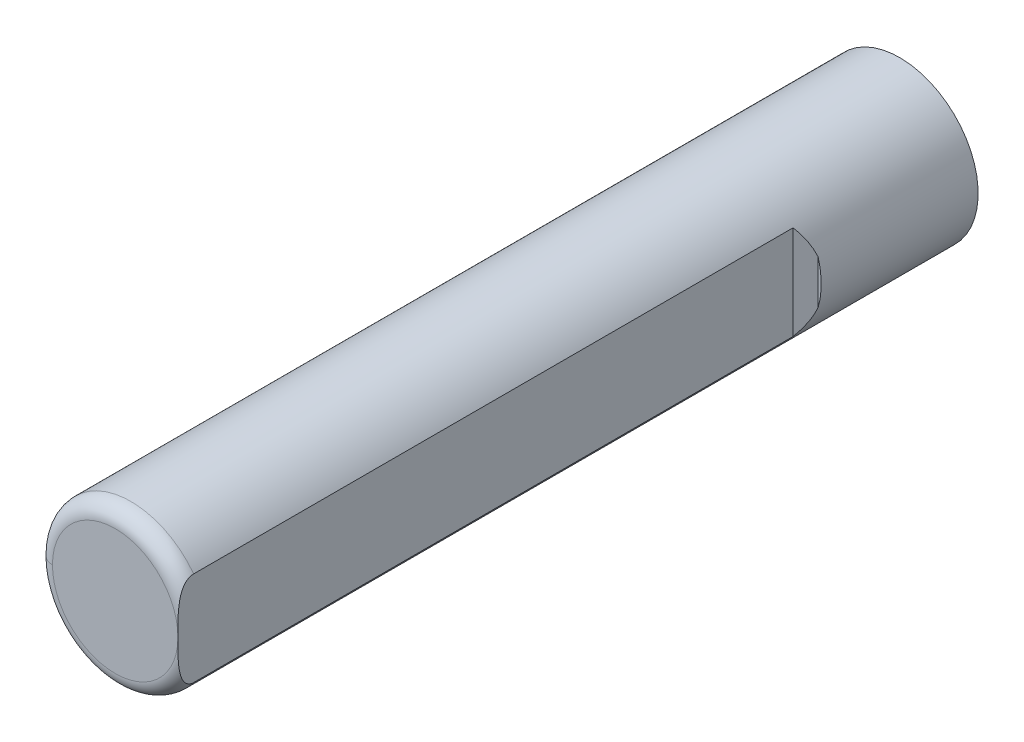
ISO-10303-21;
HEADER;
FILE_DESCRIPTION(('STEP AP214'),'2;1');
FILE_NAME('part.step','',(''),(''),'','','');
FILE_SCHEMA(('AUTOMOTIVE_DESIGN { 1 0 10303 214 1 1 1 1 }'));
ENDSEC;
DATA;
#1=APPLICATION_CONTEXT('core data for automotive mechanical design processes');
#2=APPLICATION_PROTOCOL_DEFINITION('international standard','automotive_design',2000,#1);
#3=PRODUCT_CONTEXT('',#1,'mechanical');
#4=PRODUCT('Part','Part','',(#3));
#5=PRODUCT_RELATED_PRODUCT_CATEGORY('part','',(#4));
#6=PRODUCT_DEFINITION_FORMATION('','',#4);
#7=PRODUCT_DEFINITION_CONTEXT('part definition',#1,'design');
#8=PRODUCT_DEFINITION('design','',#6,#7);
#9=PRODUCT_DEFINITION_SHAPE('','',#8);
#10=(LENGTH_UNIT() NAMED_UNIT(*) SI_UNIT(.MILLI.,.METRE.));
#11=(NAMED_UNIT(*) PLANE_ANGLE_UNIT() SI_UNIT($,.RADIAN.));
#12=(NAMED_UNIT(*) SI_UNIT($,.STERADIAN.) SOLID_ANGLE_UNIT());
#13=UNCERTAINTY_MEASURE_WITH_UNIT(LENGTH_MEASURE(1.E-05),#10,'distance_accuracy_value','');
#14=(GEOMETRIC_REPRESENTATION_CONTEXT(3) GLOBAL_UNCERTAINTY_ASSIGNED_CONTEXT((#13)) GLOBAL_UNIT_ASSIGNED_CONTEXT((#10,
#11,#12)) REPRESENTATION_CONTEXT('',''));
#15=CARTESIAN_POINT('',(0.,0.,0.));
#16=DIRECTION('',(0.,0.,1.));
#17=DIRECTION('',(1.,0.,0.));
#18=AXIS2_PLACEMENT_3D('',#15,#16,#17);
#19=CARTESIAN_POINT('',(0.,0.,0.));
#20=DIRECTION('',(0.,0.,1.));
#21=DIRECTION('',(1.,0.,0.));
#22=AXIS2_PLACEMENT_3D('',#19,#20,#21);
#23=PLANE('',#22);
#24=CARTESIAN_POINT('',(0.,0.,0.));
#25=DIRECTION('',(0.,0.,1.));
#26=DIRECTION('',(1.,0.,0.));
#27=AXIS2_PLACEMENT_3D('',#24,#25,#26);
#28=CIRCLE('',#27,2.5);
#29=CARTESIAN_POINT('',(-2.5,0.,0.));
#30=VERTEX_POINT('',#29);
#31=EDGE_CURVE('E11',#30,#30,#28,.T.);
#32=ORIENTED_EDGE('',*,*,#31,.F.);
#33=EDGE_LOOP('',(#32));
#34=FACE_BOUND('',#33,.T.);
#35=ADVANCED_FACE('F17',(#34),#23,.F.);
#36=CARTESIAN_POINT('',(0.,0.,25.));
#37=DIRECTION('',(0.,0.,1.));
#38=DIRECTION('',(1.,0.,0.));
#39=AXIS2_PLACEMENT_3D('',#36,#37,#38);
#40=PLANE('',#39);
#41=CARTESIAN_POINT('',(0.,0.,25.));
#42=DIRECTION('',(0.,0.,-1.));
#43=DIRECTION('',(-1.,0.,0.));
#44=AXIS2_PLACEMENT_3D('',#41,#42,#43);
#45=CIRCLE('',#44,2.);
#46=CARTESIAN_POINT('',(2.,0.,25.));
#47=VERTEX_POINT('',#46);
#48=CARTESIAN_POINT('',(-2.,0.,25.));
#49=VERTEX_POINT('',#48);
#50=EDGE_CURVE('E94',#47,#49,#45,.T.);
#51=ORIENTED_EDGE('',*,*,#50,.F.);
#52=CARTESIAN_POINT('',(0.,0.,25.));
#53=DIRECTION('',(0.,0.,-1.));
#54=DIRECTION('',(-1.,0.,0.));
#55=AXIS2_PLACEMENT_3D('',#52,#53,#54);
#56=CIRCLE('',#55,2.);
#57=EDGE_CURVE('E119',#49,#47,#56,.T.);
#58=ORIENTED_EDGE('',*,*,#57,.F.);
#59=EDGE_LOOP('',(#51,#58));
#60=FACE_BOUND('',#59,.T.);
#61=ADVANCED_FACE('F143',(#60),#40,.T.);
#62=CARTESIAN_POINT('',(0.,0.,0.));
#63=DIRECTION('',(0.,0.,1.));
#64=DIRECTION('',(1.,0.,0.));
#65=AXIS2_PLACEMENT_3D('',#62,#63,#64);
#66=CYLINDRICAL_SURFACE('',#65,2.5);
#67=CARTESIAN_POINT('',(0.,0.,24.5));
#68=DIRECTION('',(0.,0.,1.));
#69=DIRECTION('',(-1.,0.,0.));
#70=AXIS2_PLACEMENT_3D('',#67,#68,#69);
#71=CIRCLE('',#70,2.5);
#72=CARTESIAN_POINT('',(2.,1.5,24.5));
#73=VERTEX_POINT('',#72);
#74=CARTESIAN_POINT('',(-2.5,0.,24.5));
#75=VERTEX_POINT('',#74);
#76=EDGE_CURVE('E90',#73,#75,#71,.T.);
#77=ORIENTED_EDGE('',*,*,#76,.F.);
#78=DIRECTION('',(0.,0.,-1.));
#79=VECTOR('',#78,1.);
#80=CARTESIAN_POINT('',(2.,1.5,0.));
#81=LINE('',#80,#79);
#82=CARTESIAN_POINT('',(2.,1.5,5.4));
#83=VERTEX_POINT('',#82);
#84=EDGE_CURVE('E84',#73,#83,#81,.T.);
#85=ORIENTED_EDGE('',*,*,#84,.T.);
#86=CARTESIAN_POINT('',(0.,0.,7.4));
#87=DIRECTION('',(0.707106781186548,0.,0.707106781186547));
#88=DIRECTION('',(0.707106781186547,0.,-0.707106781186548));
#89=AXIS2_PLACEMENT_3D('',#86,#87,#88);
#90=ELLIPSE('',#89,3.53553390593274,2.5);
#91=CARTESIAN_POINT('',(2.4,0.7,5.));
#92=VERTEX_POINT('',#91);
#93=EDGE_CURVE('E87',#92,#83,#90,.T.);
#94=ORIENTED_EDGE('',*,*,#93,.F.);
#95=CARTESIAN_POINT('',(0.,0.,5.));
#96=DIRECTION('',(0.,0.,-1.));
#97=DIRECTION('',(1.,0.,0.));
#98=AXIS2_PLACEMENT_3D('',#95,#96,#97);
#99=CIRCLE('',#98,2.5);
#100=CARTESIAN_POINT('',(2.4,-0.7,5.));
#101=VERTEX_POINT('',#100);
#102=EDGE_CURVE('E55',#92,#101,#99,.T.);
#103=ORIENTED_EDGE('',*,*,#102,.T.);
#104=CARTESIAN_POINT('',(0.,0.,7.4));
#105=DIRECTION('',(0.707106781186548,0.,0.707106781186547));
#106=DIRECTION('',(0.707106781186547,0.,-0.707106781186548));
#107=AXIS2_PLACEMENT_3D('',#104,#105,#106);
#108=ELLIPSE('',#107,3.53553390593274,2.5);
#109=CARTESIAN_POINT('',(2.,-1.5,5.4));
#110=VERTEX_POINT('',#109);
#111=EDGE_CURVE('E110',#110,#101,#108,.T.);
#112=ORIENTED_EDGE('',*,*,#111,.F.);
#113=DIRECTION('',(0.,0.,1.));
#114=VECTOR('',#113,1.);
#115=CARTESIAN_POINT('',(2.,-1.5,0.));
#116=LINE('',#115,#114);
#117=CARTESIAN_POINT('',(2.,-1.5,24.5));
#118=VERTEX_POINT('',#117);
#119=EDGE_CURVE('E69',#110,#118,#116,.T.);
#120=ORIENTED_EDGE('',*,*,#119,.T.);
#121=CARTESIAN_POINT('',(0.,0.,24.5));
#122=DIRECTION('',(0.,0.,1.));
#123=DIRECTION('',(-1.,0.,0.));
#124=AXIS2_PLACEMENT_3D('',#121,#122,#123);
#125=CIRCLE('',#124,2.5);
#126=EDGE_CURVE('E253',#75,#118,#125,.T.);
#127=ORIENTED_EDGE('',*,*,#126,.F.);
#128=DIRECTION('',(0.,0.,-1.));
#129=VECTOR('',#128,1.);
#130=CARTESIAN_POINT('',(-2.5,0.,0.));
#131=LINE('',#130,#129);
#132=EDGE_CURVE('E29',#75,#30,#131,.T.);
#133=ORIENTED_EDGE('',*,*,#132,.T.);
#134=ORIENTED_EDGE('',*,*,#31,.T.);
#135=ORIENTED_EDGE('',*,*,#132,.F.);
#136=EDGE_LOOP('',(#77,#85,#94,#103,#112,#120,#127,#133,#134,#135));
#137=FACE_BOUND('',#136,.T.);
#138=ADVANCED_FACE('F85',(#137),#66,.T.);
#139=CARTESIAN_POINT('',(2.,-1.5,25.));
#140=DIRECTION('',(-1.,0.,0.));
#141=DIRECTION('',(0.,0.,1.));
#142=AXIS2_PLACEMENT_3D('',#139,#140,#141);
#143=PLANE('',#142);
#144=DIRECTION('',(0.,-1.,0.));
#145=VECTOR('',#144,1.);
#146=CARTESIAN_POINT('',(2.,-0.75,5.4));
#147=LINE('',#146,#145);
#148=EDGE_CURVE('E96',#83,#110,#147,.T.);
#149=ORIENTED_EDGE('',*,*,#148,.F.);
#150=ORIENTED_EDGE('',*,*,#84,.F.);
#151=CARTESIAN_POINT('',(2.,0.,25.));
#152=CARTESIAN_POINT('',(1.99992074184323,0.0743824040081505,24.9997759435756));
#153=CARTESIAN_POINT('',(1.99947165010355,0.148776999914972,24.9999871771074));
#154=CARTESIAN_POINT('',(1.99857028946612,0.295155966065459,24.9997552066879));
#155=CARTESIAN_POINT('',(1.99811859337683,0.367140448301951,24.9993329535788));
#156=CARTESIAN_POINT('',(1.99791959116584,0.47467564178265,24.9972067174446));
#157=CARTESIAN_POINT('',(1.99793155447054,0.510237151865557,24.99625912338));
#158=CARTESIAN_POINT('',(1.99809267915469,0.581288801031755,24.9935472748416));
#159=CARTESIAN_POINT('',(1.99824167988418,0.616778974929288,24.9917839778249));
#160=CARTESIAN_POINT('',(1.99862313534803,0.687809287827659,24.9871059654056));
#161=CARTESIAN_POINT('',(1.99885587167854,0.723349187429095,24.9841873614385));
#162=CARTESIAN_POINT('',(1.99916605741556,0.776633119726084,24.9786642473142));
#163=CARTESIAN_POINT('',(1.99926316559772,0.79443591334173,24.9766256027941));
#164=CARTESIAN_POINT('',(1.99942799313971,0.830070067970469,24.9721067798214));
#165=CARTESIAN_POINT('',(1.99949557357409,0.847901176122075,24.9696245899772));
#166=CARTESIAN_POINT('',(1.99955300446813,0.888547536486016,24.9634177503319));
#167=CARTESIAN_POINT('',(1.99951532397822,0.91133988401974,24.9595404524321));
#168=CARTESIAN_POINT('',(1.99930867283003,0.955943231038525,24.9510482605722));
#169=CARTESIAN_POINT('',(1.99914444800875,0.977760164027869,24.9464647218206));
#170=CARTESIAN_POINT('',(1.9987470058683,1.02036229047338,24.9365155069451));
#171=CARTESIAN_POINT('',(1.99851657793048,1.04115570548247,24.9311852083642));
#172=CARTESIAN_POINT('',(1.99802974814901,1.0816574895716,24.9197062246499));
#173=CARTESIAN_POINT('',(1.99777468449466,1.10137685141119,24.913596853842));
#174=CARTESIAN_POINT('',(1.99739840013948,1.13038024379066,24.9036976133648));
#175=CARTESIAN_POINT('',(1.99727587510661,1.13981027725539,24.900332804047));
#176=CARTESIAN_POINT('',(1.99703817581608,1.15837649346644,24.8933928369149));
#177=CARTESIAN_POINT('',(1.99692290310413,1.16751476547877,24.8898232958931));
#178=CARTESIAN_POINT('',(1.99670332283443,1.18548877285787,24.8824714382482));
#179=CARTESIAN_POINT('',(1.99659883979227,1.19432687958857,24.8786949344353));
#180=CARTESIAN_POINT('',(1.99640396912614,1.21169177323568,24.8709270027819));
#181=CARTESIAN_POINT('',(1.99631333664323,1.22022122896917,24.8669415608728));
#182=CARTESIAN_POINT('',(1.99614882223497,1.2369596175537,24.8587541929477));
#183=CARTESIAN_POINT('',(1.99607463467166,1.24517153585325,24.8545583896463));
#184=CARTESIAN_POINT('',(1.99594517300726,1.26126533183318,24.8459493011108));
#185=CARTESIAN_POINT('',(1.99588954260673,1.26915052438995,24.8415422314282));
#186=CARTESIAN_POINT('',(1.9957988546951,1.2845810374423,24.8325102373854));
#187=CARTESIAN_POINT('',(1.99576340175056,1.2921300087043,24.8278915673767));
#188=CARTESIAN_POINT('',(1.99571421125412,1.3068779700524,24.8184366653795));
#189=CARTESIAN_POINT('',(1.99570005204294,1.31408094375696,24.8136066625062));
#190=CARTESIAN_POINT('',(1.99569406125293,1.32812655721362,24.803730101339));
#191=CARTESIAN_POINT('',(1.99570179589208,1.3349734981079,24.7986896728774));
#192=CARTESIAN_POINT('',(1.99573966154816,1.34829649729819,24.7883940205325));
#193=CARTESIAN_POINT('',(1.99576936162992,1.35477714326881,24.783144744193));
#194=CARTESIAN_POINT('',(1.99585066984195,1.36735684576008,24.772433972697));
#195=CARTESIAN_POINT('',(1.99590186522548,1.373460726845,24.7669781522206));
#196=CARTESIAN_POINT('',(1.99602510856625,1.38527614180958,24.7558576563887));
#197=CARTESIAN_POINT('',(1.99609677691371,1.39099266463528,24.7501982893881));
#198=CARTESIAN_POINT('',(1.99625932484143,1.4020224438202,24.7386751435514));
#199=CARTESIAN_POINT('',(1.99634987174126,1.4073407595873,24.732816209216));
#200=CARTESIAN_POINT('',(1.99654796864135,1.41756375853488,24.7208985534172));
#201=CARTESIAN_POINT('',(1.99665524381451,1.42247344194377,24.7148441357418));
#202=CARTESIAN_POINT('',(1.99682731556004,1.42954211500895,24.7055881483673));
#203=CARTESIAN_POINT('',(1.99688620021312,1.4318379198452,24.7024902036541));
#204=CARTESIAN_POINT('',(1.99700706247235,1.43632276646332,24.6962473266312));
#205=CARTESIAN_POINT('',(1.99706901833451,1.43851238813219,24.6931028115351));
#206=CARTESIAN_POINT('',(1.99719558211312,1.44278346410645,24.686767770409));
#207=CARTESIAN_POINT('',(1.99726017252742,1.44486547300804,24.6835776179058));
#208=CARTESIAN_POINT('',(1.9973915254633,1.44892005216089,24.677152204731));
#209=CARTESIAN_POINT('',(1.99745827461723,1.45089314521046,24.6739172738808));
#210=CARTESIAN_POINT('',(1.99759342793202,1.45472860421019,24.6674032994356));
#211=CARTESIAN_POINT('',(1.99766182263048,1.45659145540954,24.6641245414755));
#212=CARTESIAN_POINT('',(1.99779971224839,1.46020516767773,24.6575239569899));
#213=CARTESIAN_POINT('',(1.99786920126793,1.46195647040382,24.6542023722468));
#214=CARTESIAN_POINT('',(1.99800868722428,1.46534583949,24.6475172389961));
#215=CARTESIAN_POINT('',(1.99807868136002,1.46698429794566,24.6441538893039));
#216=CARTESIAN_POINT('',(1.99821854776643,1.47014675399115,24.6373863885316));
#217=CARTESIAN_POINT('',(1.99828841974943,1.47167108825015,24.6339823948332));
#218=CARTESIAN_POINT('',(1.99842737472124,1.47460409441989,24.627134826837));
#219=CARTESIAN_POINT('',(1.99849645922938,1.4760130419326,24.623691370662));
#220=CARTESIAN_POINT('',(1.99863313494216,1.47871409833955,24.6167661566476));
#221=CARTESIAN_POINT('',(1.99870072864957,1.48000641645379,24.6132844804883));
#222=CARTESIAN_POINT('',(1.99883368148878,1.48247306489063,24.6062841635624));
#223=CARTESIAN_POINT('',(1.99889904317281,1.48364753316845,24.6027655714698));
#224=CARTESIAN_POINT('',(1.99902675399531,1.48587736176063,24.5956928177327));
#225=CARTESIAN_POINT('',(1.99908910470066,1.4869327844153,24.5921386757761));
#226=CARTESIAN_POINT('',(1.99920997921112,1.48892343241179,24.5849962752541));
#227=CARTESIAN_POINT('',(1.99926850247444,1.4898586407548,24.5814080119407));
#228=CARTESIAN_POINT('',(1.99938087172778,1.49160780344044,24.5741988794108));
#229=CARTESIAN_POINT('',(1.99943471387041,1.49242165842888,24.5705779860233));
#230=CARTESIAN_POINT('',(1.99953683489529,1.49392709197238,24.5633051617528));
#231=CARTESIAN_POINT('',(1.999585105371,1.49461848657736,24.5596531926705));
#232=CARTESIAN_POINT('',(1.9996751619661,1.49587801353851,24.5523198429043));
#233=CARTESIAN_POINT('',(1.9997169338283,1.49644587593634,24.5486384156774));
#234=CARTESIAN_POINT('',(1.9997930373722,1.49745738868038,24.5412478334947));
#235=CARTESIAN_POINT('',(1.99982734763612,1.49790068250164,24.5375386295288));
#236=CARTESIAN_POINT('',(1.99988753854056,1.49866215479743,24.5300942337217));
#237=CARTESIAN_POINT('',(1.99991338929656,1.49897989052143,24.5263589963608));
#238=CARTESIAN_POINT('',(1.99995563677755,1.49948935877285,24.5188643371137));
#239=CARTESIAN_POINT('',(1.99997199386013,1.49968056340767,24.5151048791658));
#240=CARTESIAN_POINT('',(1.99999420278539,1.49993622211801,24.5075636175834));
#241=CARTESIAN_POINT('',(2.00000000401141,1.50000006562097,24.5037817930697));
#242=CARTESIAN_POINT('',(2.,1.5,24.5));
#243=B_SPLINE_CURVE_WITH_KNOTS('',3,(#151,#152,#153,#154,#155,#156,#157,#158,#159,#160,#161,
#162,#163,#164,#165,#166,#167,#168,#169,#170,#171,#172,#173,#174,#175,#176,#177,#178,#179,#180,
#181,#182,#183,#184,#185,#186,#187,#188,#189,#190,#191,#192,#193,#194,#195,#196,#197,#198,#199,
#200,#201,#202,#203,#204,#205,#206,#207,#208,#209,#210,#211,#212,#213,#214,#215,#216,#217,#218,
#219,#220,#221,#222,#223,#224,#225,#226,#227,#228,#229,#230,#231,#232,#233,#234,#235,#236,#237,
#238,#239,#240,#241,#242),.UNSPECIFIED.,.F.,.F.,(4,2,2,2,2,2,2,2,2,2,2,2,2,2,2,2,2,2,2,2,2,2,2,
2,2,2,2,2,2,2,2,2,2,2,2,2,2,2,2,2,2,2,2,2,2,4),(0.,0.223172054846662,0.439124197585328,
0.545839732296489,0.65243032285543,0.759382771893219,0.813136513223052,0.867140507034983,
0.936483899651625,1.00334616709482,1.06772478154059,1.12962976623202,1.15966544195983,
1.18909485021444,1.21792499202369,1.24616466860126,1.27382469544112,1.30091812600091,
1.32746048205873,1.35346998659739,1.37896779359694,1.40397820742243,1.42852888264476,
1.45265099324951,1.47637935846879,1.49975251118629,1.51132017759782,1.52281520531708,
1.53424343901913,1.54561093859512,1.55692397085945,1.5681889995602,1.57941267368493,
1.59060181408157,1.60176339844372,1.61290454474028,1.62403249320015,1.63515458699235,
1.64627825176993,1.65741097427033,1.66856028018549,1.67973371153017,1.6909388037469,
1.70218306278963,1.71347394242545,1.72481882198593),.UNSPECIFIED.);
#244=EDGE_CURVE('E274',#47,#73,#243,.T.);
#245=ORIENTED_EDGE('',*,*,#244,.F.);
#246=CARTESIAN_POINT('',(2.,-1.50000000000001,24.5));
#247=CARTESIAN_POINT('',(2.00000000399132,-1.50000006563573,24.5037810940668));
#248=CARTESIAN_POINT('',(1.99999421561345,-1.49993623144627,24.5075622195439));
#249=CARTESIAN_POINT('',(1.99997205697949,-1.49968061042032,24.5151021063339));
#250=CARTESIAN_POINT('',(1.99995573716839,-1.49948943340924,24.5188608885005));
#251=CARTESIAN_POINT('',(1.99991358740634,-1.49898003836333,24.5263542204352));
#252=CARTESIAN_POINT('',(1.99988779694957,-1.49866234745467,24.530088806213));
#253=CARTESIAN_POINT('',(1.99982774837418,-1.49790098164695,24.5375319240111));
#254=CARTESIAN_POINT('',(1.9997935200149,-1.49745774871636,24.541240501471));
#255=CARTESIAN_POINT('',(1.99971760057908,-1.49644637348462,24.548629856611));
#256=CARTESIAN_POINT('',(1.99967593081729,-1.49587858691427,24.5523106831922));
#257=CARTESIAN_POINT('',(1.99958609729531,-1.49461922619788,24.5596428583638));
#258=CARTESIAN_POINT('',(1.99953794771036,-1.49392792120797,24.563294253359));
#259=CARTESIAN_POINT('',(1.99943608592234,-1.49242268032972,24.5705659567931));
#260=CARTESIAN_POINT('',(1.99938238206364,-1.49160892758544,24.5741863032641));
#261=CARTESIAN_POINT('',(1.99927030542703,-1.48985998165895,24.5813943698558));
#262=CARTESIAN_POINT('',(1.99921193645254,-1.4889248870255,24.5849821139518));
#263=CARTESIAN_POINT('',(1.99909138517417,-1.48693447754829,24.592123504408));
#264=CARTESIAN_POINT('',(1.99902920338463,-1.48587917890295,24.5956771552927));
#265=CARTESIAN_POINT('',(1.99890184366701,-1.48364960825592,24.6027489556478));
#266=CARTESIAN_POINT('',(1.9988366641592,-1.48247527312296,24.6062670851803));
#267=CARTESIAN_POINT('',(1.99870408757909,-1.48000889972897,24.6132665060608));
#268=CARTESIAN_POINT('',(1.99863668795428,-1.47871672273548,24.6167477484599));
#269=CARTESIAN_POINT('',(1.99850041096228,-1.47601595615343,24.6236721242634));
#270=CARTESIAN_POINT('',(1.99843153110252,-1.47460715658536,24.6271151756904));
#271=CARTESIAN_POINT('',(1.99829299464851,-1.47167445272558,24.6339619636573));
#272=CARTESIAN_POINT('',(1.99822333655343,-1.47015027209375,24.6373655817575));
#273=CARTESIAN_POINT('',(1.99808390582678,-1.46698812857087,24.6441323608831));
#274=CARTESIAN_POINT('',(1.99801413350746,-1.46534982829707,24.6474953641925));
#275=CARTESIAN_POINT('',(1.99787509778888,-1.46196077970409,24.6541798342375));
#276=CARTESIAN_POINT('',(1.99780583721916,-1.4602096386031,24.6575011018091));
#277=CARTESIAN_POINT('',(1.99766840982566,-1.45659625259223,24.6641010814509));
#278=CARTESIAN_POINT('',(1.997600248932,-1.45473356536847,24.6673795513789));
#279=CARTESIAN_POINT('',(1.99746556729084,-1.45089843622538,24.6738929791291));
#280=CARTESIAN_POINT('',(1.99739905603568,-1.44892550843156,24.6771276509486));
#281=CARTESIAN_POINT('',(1.99726818171999,-1.44487126061359,24.6835525752369));
#282=CARTESIAN_POINT('',(1.9972038320548,-1.44278941719844,24.6867424975116));
#283=CARTESIAN_POINT('',(1.99707775137785,-1.43851867197544,24.6930771070898));
#284=CARTESIAN_POINT('',(1.9970160378919,-1.43632921501186,24.6962214204918));
#285=CARTESIAN_POINT('',(1.99689566078269,-1.43184469652409,24.7024639227359));
#286=CARTESIAN_POINT('',(1.99683701892137,-1.42954905458725,24.7055616939901));
#287=CARTESIAN_POINT('',(1.99666567638382,-1.42248084630881,24.7148172308382));
#288=CARTESIAN_POINT('',(1.99655888464373,-1.41757147940715,24.7208713836758));
#289=CARTESIAN_POINT('',(1.99636174221657,-1.40734909879179,24.7327886205365));
#290=CARTESIAN_POINT('',(1.99627166629832,-1.40203108143092,24.7386473979103));
#291=CARTESIAN_POINT('',(1.99611003922808,-1.39100187721442,24.7501703358719));
#292=CARTESIAN_POINT('',(1.99603882052501,-1.38528562800562,24.7558296492698));
#293=CARTESIAN_POINT('',(1.99591644695386,-1.3734707318766,24.7669501386243));
#294=CARTESIAN_POINT('',(1.99586567127212,-1.36736709349256,24.7724060037394));
#295=CARTESIAN_POINT('',(1.99578516490665,-1.35478784219522,24.7831169592244));
#296=CARTESIAN_POINT('',(1.99575584634693,-1.34830740256969,24.7883663726514));
#297=CARTESIAN_POINT('',(1.99571869849206,-1.33498477681348,24.798662387302));
#298=CARTESIAN_POINT('',(1.9957112993111,-1.32813800117373,24.803703038946));
#299=CARTESIAN_POINT('',(1.99571790844575,-1.31409267471328,24.8135801275401));
#300=CARTESIAN_POINT('',(1.99573234953225,-1.3068898211763,24.8184104328418));
#301=CARTESIAN_POINT('',(1.9957820442345,-1.29214205319938,24.8278660132856));
#302=CARTESIAN_POINT('',(1.99581771832153,-1.28459315378014,24.8324850576994));
#303=CARTESIAN_POINT('',(1.99590878235871,-1.26916273481097,24.8415178663418));
#304=CARTESIAN_POINT('',(1.9959645663944,-1.26127756330698,24.8459253747873));
#305=CARTESIAN_POINT('',(1.99609426291563,-1.24518375800485,24.8545353985799));
#306=CARTESIAN_POINT('',(1.99616853021196,-1.23697180828319,24.8587316971011));
#307=CARTESIAN_POINT('',(1.99633312578899,-1.22023330440732,24.8669201049451));
#308=CARTESIAN_POINT('',(1.99642375809862,-1.21170376387214,24.8709060904115));
#309=CARTESIAN_POINT('',(1.99661854459464,-1.19433864795532,24.8786751502783));
#310=CARTESIAN_POINT('',(1.99672294193094,-1.18550040291942,24.8824522377143));
#311=CARTESIAN_POINT('',(1.99694226187486,-1.16752606681071,24.8898052952301));
#312=CARTESIAN_POINT('',(1.99705735817945,-1.15838760361716,24.8933754515532));
#313=CARTESIAN_POINT('',(1.99729461081861,-1.13982095429441,24.9003166734778));
#314=CARTESIAN_POINT('',(1.99741686375671,-1.13039067821484,24.9036821214078));
#315=CARTESIAN_POINT('',(1.99779217628216,-1.10138644360348,24.9135833318085));
#316=CARTESIAN_POINT('',(1.99804639182045,-1.08166645052049,24.9196940201576));
#317=CARTESIAN_POINT('',(1.99853110270045,-1.04116323628081,24.9311756407437));
#318=CARTESIAN_POINT('',(1.99876024417391,-1.02036901834845,24.9365072526102));
#319=CARTESIAN_POINT('',(1.99915470539777,-0.977765151328263,24.9464590183759));
#320=CARTESIAN_POINT('',(1.99931722183155,-0.955947277481583,24.9510437883393));
#321=CARTESIAN_POINT('',(1.9995198829506,-0.911341967303855,24.9595383564086));
#322=CARTESIAN_POINT('',(1.99955526292885,-0.88854859550089,24.963416794788));
#323=CARTESIAN_POINT('',(1.99949382204101,-0.847905203674999,24.9696245930138));
#324=CARTESIAN_POINT('',(1.99942453870162,-0.830078121263526,24.9721068020774));
#325=CARTESIAN_POINT('',(1.99925681951571,-0.794451476716698,24.9766256440943));
#326=CARTESIAN_POINT('',(1.99915851941381,-0.776652166020984,24.9786642766866));
#327=CARTESIAN_POINT('',(1.9988453002743,-0.723377092775604,24.9841874622418));
#328=CARTESIAN_POINT('',(1.9986112537578,-0.687842544959193,24.987106032342));
#329=CARTESIAN_POINT('',(1.9982283563235,-0.616820796922946,24.9917840495079));
#330=CARTESIAN_POINT('',(1.99807922477729,-0.581333831994754,24.9935473175813));
#331=CARTESIAN_POINT('',(1.99791864894759,-0.510286463240811,24.9962591622343));
#332=CARTESIAN_POINT('',(1.99790737458157,-0.474726022807438,24.9972067320794));
#333=CARTESIAN_POINT('',(1.99810913282421,-0.36718761457327,24.9993330516778));
#334=CARTESIAN_POINT('',(1.99856362977525,-0.295198855774381,24.9997552624957));
#335=CARTESIAN_POINT('',(1.99946981887737,-0.148802747024418,24.9999871328031));
#336=CARTESIAN_POINT('',(1.99992090533855,-0.0743952844974829,24.9997757658396));
#337=CARTESIAN_POINT('',(2.,0.,25.));
#338=B_SPLINE_CURVE_WITH_KNOTS('',3,(#246,#247,#248,#249,#250,#251,#252,#253,#254,#255,#256,
#257,#258,#259,#260,#261,#262,#263,#264,#265,#266,#267,#268,#269,#270,#271,#272,#273,#274,#275,
#276,#277,#278,#279,#280,#281,#282,#283,#284,#285,#286,#287,#288,#289,#290,#291,#292,#293,#294,
#295,#296,#297,#298,#299,#300,#301,#302,#303,#304,#305,#306,#307,#308,#309,#310,#311,#312,#313,
#314,#315,#316,#317,#318,#319,#320,#321,#322,#323,#324,#325,#326,#327,#328,#329,#330,#331,#332,
#333,#334,#335,#336,#337),.UNSPECIFIED.,.F.,.F.,(4,2,2,2,2,2,2,2,2,2,2,2,2,2,2,2,2,2,2,2,2,2,2,
2,2,2,2,2,2,2,2,2,2,2,2,2,2,2,2,2,2,2,2,2,2,4),(0.,0.011342782579734,0.0226316331167205,
0.0338739321601057,0.045077134591934,0.0562487473694846,0.0673963068190268,0.0785273557123727,
0.0896494203659894,0.100769988004818,0.111896484629207,0.123036253613643,0.134196535250424,
0.145384447431044,0.156606967633486,0.167870916355677,0.179182942105824,0.190549508029255,
0.201976880220988,0.21347111774356,0.22503806434205,0.248409984888084,0.27213738611707,
0.296258790648629,0.320809006592457,0.345819196168199,0.371317001718556,0.397326715063987,
0.423869477435113,0.450963498941028,0.478624288415576,0.506864886333452,0.535696095181801,
0.565126703145553,0.595163698194985,0.657071627398658,0.72145350629703,0.78831925121179,
0.857666225541247,0.911658283646659,0.965401657384894,1.07233811102091,1.17891907692563,
1.28563139720811,1.50159641628553,1.72480710029386),.UNSPECIFIED.);
#339=EDGE_CURVE('E124',#118,#47,#338,.T.);
#340=ORIENTED_EDGE('',*,*,#339,.F.);
#341=ORIENTED_EDGE('',*,*,#119,.F.);
#342=EDGE_LOOP('',(#149,#150,#245,#340,#341));
#343=FACE_BOUND('',#342,.T.);
#344=ADVANCED_FACE('F97',(#343),#143,.F.);
#345=CARTESIAN_POINT('',(0.,0.,24.5));
#346=DIRECTION('',(0.,0.,1.));
#347=DIRECTION('',(1.,0.,0.));
#348=AXIS2_PLACEMENT_3D('',#345,#346,#347);
#349=TOROIDAL_SURFACE('',#348,2.,0.5);
#350=CARTESIAN_POINT('',(-2.,0.,24.5));
#351=DIRECTION('',(0.,-1.,0.));
#352=DIRECTION('',(-1.,0.,0.));
#353=AXIS2_PLACEMENT_3D('',#350,#351,#352);
#354=CIRCLE('',#353,0.5);
#355=EDGE_CURVE('E115',#49,#75,#354,.T.);
#356=ORIENTED_EDGE('',*,*,#355,.T.);
#357=ORIENTED_EDGE('',*,*,#126,.T.);
#358=ORIENTED_EDGE('',*,*,#339,.T.);
#359=ORIENTED_EDGE('',*,*,#50,.T.);
#360=EDGE_LOOP('',(#356,#357,#358,#359));
#361=FACE_BOUND('',#360,.T.);
#362=ADVANCED_FACE('F130',(#361),#349,.T.);
#363=CARTESIAN_POINT('',(2.25,0.,5.));
#364=DIRECTION('',(0.,0.,1.));
#365=DIRECTION('',(1.,0.,0.));
#366=AXIS2_PLACEMENT_3D('',#363,#364,#365);
#367=PLANE('',#366);
#368=DIRECTION('',(0.,1.,0.));
#369=VECTOR('',#368,1.);
#370=CARTESIAN_POINT('',(2.4,-0.75,5.));
#371=LINE('',#370,#369);
#372=EDGE_CURVE('E103',#101,#92,#371,.T.);
#373=ORIENTED_EDGE('',*,*,#372,.F.);
#374=ORIENTED_EDGE('',*,*,#102,.F.);
#375=EDGE_LOOP('',(#373,#374));
#376=FACE_BOUND('',#375,.T.);
#377=ADVANCED_FACE('F140',(#376),#367,.T.);
#378=CARTESIAN_POINT('',(2.2,-0.75,5.2));
#379=DIRECTION('',(0.707106781186548,0.,0.707106781186547));
#380=DIRECTION('',(0.,-1.,0.));
#381=AXIS2_PLACEMENT_3D('',#378,#379,#380);
#382=PLANE('',#381);
#383=ORIENTED_EDGE('',*,*,#111,.T.);
#384=ORIENTED_EDGE('',*,*,#372,.T.);
#385=ORIENTED_EDGE('',*,*,#93,.T.);
#386=ORIENTED_EDGE('',*,*,#148,.T.);
#387=EDGE_LOOP('',(#383,#384,#385,#386));
#388=FACE_BOUND('',#387,.T.);
#389=ADVANCED_FACE('F102',(#388),#382,.T.);
#390=CARTESIAN_POINT('',(0.,0.,24.5));
#391=DIRECTION('',(0.,0.,1.));
#392=DIRECTION('',(1.,0.,0.));
#393=AXIS2_PLACEMENT_3D('',#390,#391,#392);
#394=TOROIDAL_SURFACE('',#393,2.,0.5);
#395=ORIENTED_EDGE('',*,*,#355,.F.);
#396=ORIENTED_EDGE('',*,*,#57,.T.);
#397=ORIENTED_EDGE('',*,*,#244,.T.);
#398=ORIENTED_EDGE('',*,*,#76,.T.);
#399=EDGE_LOOP('',(#395,#396,#397,#398));
#400=FACE_BOUND('',#399,.T.);
#401=ADVANCED_FACE('F19',(#400),#394,.T.);
#402=CLOSED_SHELL('',(#35,#61,#138,#344,#362,#377,#389,#401));
#403=MANIFOLD_SOLID_BREP('B1',#402);
#404=ADVANCED_BREP_SHAPE_REPRESENTATION('',(#18,#403),#14);
#405=SHAPE_DEFINITION_REPRESENTATION(#9,#404);
ENDSEC;
END-ISO-10303-21;
